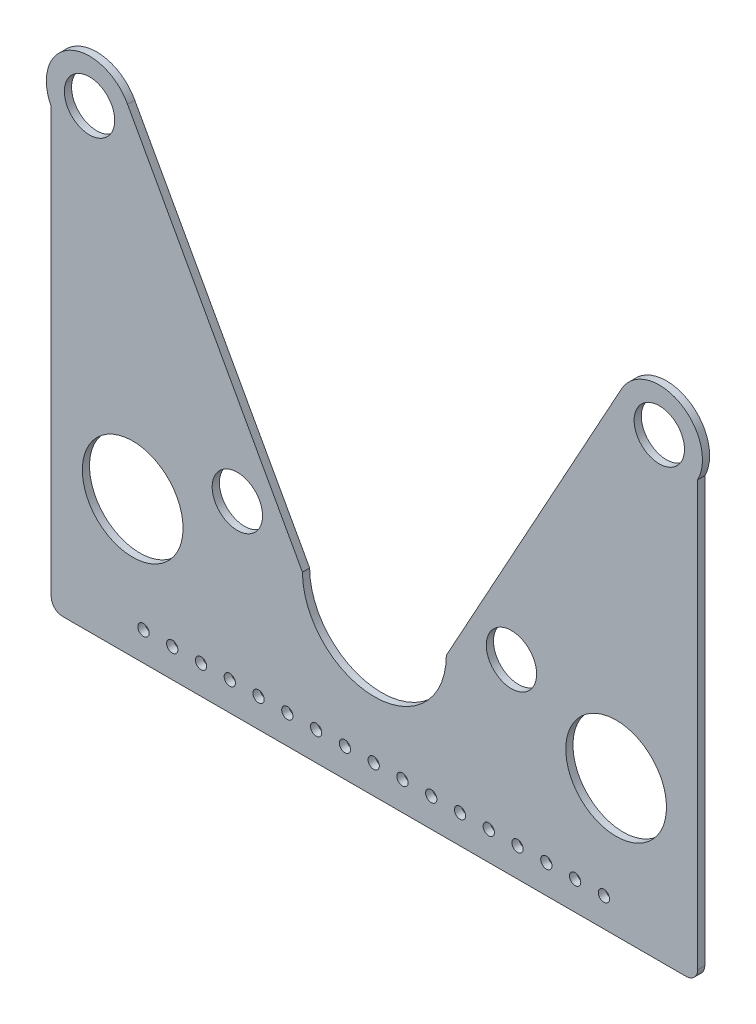
ISO-10303-21;
HEADER;
FILE_DESCRIPTION(('STEP AP214'),'2;1');
FILE_NAME('part.step','',(''),(''),'','','');
FILE_SCHEMA(('AUTOMOTIVE_DESIGN { 1 0 10303 214 1 1 1 1 }'));
ENDSEC;
DATA;
#1=APPLICATION_CONTEXT('core data for automotive mechanical design processes');
#2=APPLICATION_PROTOCOL_DEFINITION('international standard','automotive_design',2000,#1);
#3=PRODUCT_CONTEXT('',#1,'mechanical');
#4=PRODUCT('Part','Part','',(#3));
#5=PRODUCT_RELATED_PRODUCT_CATEGORY('part','',(#4));
#6=PRODUCT_DEFINITION_FORMATION('','',#4);
#7=PRODUCT_DEFINITION_CONTEXT('part definition',#1,'design');
#8=PRODUCT_DEFINITION('design','',#6,#7);
#9=PRODUCT_DEFINITION_SHAPE('','',#8);
#10=(LENGTH_UNIT() NAMED_UNIT(*) SI_UNIT(.MILLI.,.METRE.));
#11=(NAMED_UNIT(*) PLANE_ANGLE_UNIT() SI_UNIT($,.RADIAN.));
#12=(NAMED_UNIT(*) SI_UNIT($,.STERADIAN.) SOLID_ANGLE_UNIT());
#13=UNCERTAINTY_MEASURE_WITH_UNIT(LENGTH_MEASURE(1.E-05),#10,'distance_accuracy_value','');
#14=(GEOMETRIC_REPRESENTATION_CONTEXT(3) GLOBAL_UNCERTAINTY_ASSIGNED_CONTEXT((#13)) GLOBAL_UNIT_ASSIGNED_CONTEXT((#10,
#11,#12)) REPRESENTATION_CONTEXT('',''));
#15=CARTESIAN_POINT('',(0.,0.,0.));
#16=DIRECTION('',(0.,0.,1.));
#17=DIRECTION('',(1.,0.,0.));
#18=AXIS2_PLACEMENT_3D('',#15,#16,#17);
#19=CARTESIAN_POINT('',(125.72681492115,131.243846083957,3.175));
#20=DIRECTION('',(0.,0.,-1.));
#21=DIRECTION('',(-1.,0.,0.));
#22=AXIS2_PLACEMENT_3D('',#19,#20,#21);
#23=CYLINDRICAL_SURFACE('',#22,19.0499999999926);
#24=CARTESIAN_POINT('',(125.72681492115,131.243846083957,0.));
#25=DIRECTION('',(0.,0.,1.));
#26=DIRECTION('',(1.,0.,0.));
#27=AXIS2_PLACEMENT_3D('',#24,#25,#26);
#28=CIRCLE('',#27,19.0499999999926);
#29=CARTESIAN_POINT('',(108.918256202556,140.209048468959,0.));
#30=VERTEX_POINT('',#29);
#31=CARTESIAN_POINT('',(142.632381684572,122.462939957225,0.));
#32=VERTEX_POINT('',#31);
#33=EDGE_CURVE('E253',#30,#32,#28,.F.);
#34=ORIENTED_EDGE('',*,*,#33,.F.);
#35=DIRECTION('',(0.,0.,-1.));
#36=VECTOR('',#35,1.);
#37=CARTESIAN_POINT('',(108.918256202556,140.209048468959,3.175));
#38=LINE('',#37,#36);
#39=CARTESIAN_POINT('',(108.918256202556,140.209048468959,3.175));
#40=VERTEX_POINT('',#39);
#41=EDGE_CURVE('E11',#40,#30,#38,.T.);
#42=ORIENTED_EDGE('',*,*,#41,.F.);
#43=CARTESIAN_POINT('',(125.72681492115,131.243846083957,3.175));
#44=DIRECTION('',(0.,0.,1.));
#45=DIRECTION('',(1.,0.,0.));
#46=AXIS2_PLACEMENT_3D('',#43,#44,#45);
#47=CIRCLE('',#46,19.0499999999926);
#48=CARTESIAN_POINT('',(142.632381684572,122.462939957225,3.175));
#49=VERTEX_POINT('',#48);
#50=EDGE_CURVE('E352',#40,#49,#47,.F.);
#51=ORIENTED_EDGE('',*,*,#50,.T.);
#52=DIRECTION('',(0.,0.,-1.));
#53=VECTOR('',#52,1.);
#54=CARTESIAN_POINT('',(142.632381684572,122.462939957225,3.175));
#55=LINE('',#54,#53);
#56=EDGE_CURVE('E104',#49,#32,#55,.T.);
#57=ORIENTED_EDGE('',*,*,#56,.T.);
#58=EDGE_LOOP('',(#34,#42,#51,#57));
#59=FACE_BOUND('',#58,.T.);
#60=ADVANCED_FACE('F45',(#59),#23,.T.);
#61=CARTESIAN_POINT('',(24.3683765677402,-13.4118671138123,3.175));
#62=DIRECTION('',(-0.876075295504555,0.48217432180344,0.));
#63=DIRECTION('',(-0.48217432180344,-0.876075295504555,0.));
#64=AXIS2_PLACEMENT_3D('',#61,#62,#63);
#65=PLANE('',#64);
#66=DIRECTION('',(0.48217432180344,0.876075295504555,0.));
#67=VECTOR('',#66,1.);
#68=CARTESIAN_POINT('',(24.3683765677402,-13.4118671138123,0.));
#69=LINE('',#68,#67);
#70=CARTESIAN_POINT('',(31.75,0.,0.));
#71=VERTEX_POINT('',#70);
#72=EDGE_CURVE('E256',#71,#30,#69,.T.);
#73=ORIENTED_EDGE('',*,*,#72,.F.);
#74=DIRECTION('',(0.,0.,-1.));
#75=VECTOR('',#74,1.);
#76=CARTESIAN_POINT('',(31.75,0.,3.175));
#77=LINE('',#76,#75);
#78=CARTESIAN_POINT('',(31.75,0.,3.175));
#79=VERTEX_POINT('',#78);
#80=EDGE_CURVE('E55',#79,#71,#77,.T.);
#81=ORIENTED_EDGE('',*,*,#80,.F.);
#82=DIRECTION('',(0.48217432180344,0.876075295504555,0.));
#83=VECTOR('',#82,1.);
#84=CARTESIAN_POINT('',(24.3683765677402,-13.4118671138123,3.175));
#85=LINE('',#84,#83);
#86=EDGE_CURVE('E348',#79,#40,#85,.T.);
#87=ORIENTED_EDGE('',*,*,#86,.T.);
#88=ORIENTED_EDGE('',*,*,#41,.T.);
#89=EDGE_LOOP('',(#73,#81,#87,#88));
#90=FACE_BOUND('',#89,.T.);
#91=ADVANCED_FACE('F334',(#90),#65,.T.);
#92=CARTESIAN_POINT('',(0.,0.,3.175));
#93=DIRECTION('',(0.,0.,-1.));
#94=DIRECTION('',(-1.,0.,0.));
#95=AXIS2_PLACEMENT_3D('',#92,#93,#94);
#96=CYLINDRICAL_SURFACE('',#95,31.75);
#97=CARTESIAN_POINT('',(0.,0.,0.));
#98=DIRECTION('',(0.,0.,1.));
#99=DIRECTION('',(1.,0.,0.));
#100=AXIS2_PLACEMENT_3D('',#97,#98,#99);
#101=CIRCLE('',#100,31.75);
#102=CARTESIAN_POINT('',(-31.75,0.,0.));
#103=VERTEX_POINT('',#102);
#104=EDGE_CURVE('E260',#103,#71,#101,.T.);
#105=ORIENTED_EDGE('',*,*,#104,.F.);
#106=DIRECTION('',(0.,0.,-1.));
#107=VECTOR('',#106,1.);
#108=CARTESIAN_POINT('',(-31.75,0.,3.175));
#109=LINE('',#108,#107);
#110=CARTESIAN_POINT('',(-31.75,0.,3.175));
#111=VERTEX_POINT('',#110);
#112=EDGE_CURVE('E321',#111,#103,#109,.T.);
#113=ORIENTED_EDGE('',*,*,#112,.F.);
#114=CARTESIAN_POINT('',(0.,0.,3.175));
#115=DIRECTION('',(0.,0.,1.));
#116=DIRECTION('',(1.,0.,0.));
#117=AXIS2_PLACEMENT_3D('',#114,#115,#116);
#118=CIRCLE('',#117,31.75);
#119=EDGE_CURVE('E330',#111,#79,#118,.T.);
#120=ORIENTED_EDGE('',*,*,#119,.T.);
#121=ORIENTED_EDGE('',*,*,#80,.T.);
#122=EDGE_LOOP('',(#105,#113,#120,#121));
#123=FACE_BOUND('',#122,.T.);
#124=ADVANCED_FACE('F328',(#123),#96,.F.);
#125=CARTESIAN_POINT('',(-24.3683765677402,-13.4118671138123,3.175));
#126=DIRECTION('',(-0.876075295504555,-0.48217432180344,0.));
#127=DIRECTION('',(0.48217432180344,-0.876075295504555,0.));
#128=AXIS2_PLACEMENT_3D('',#125,#126,#127);
#129=PLANE('',#128);
#130=DIRECTION('',(-0.48217432180344,0.876075295504555,0.));
#131=VECTOR('',#130,1.);
#132=CARTESIAN_POINT('',(-24.3683765677402,-13.4118671138123,0.));
#133=LINE('',#132,#131);
#134=CARTESIAN_POINT('',(-108.918256202556,140.209048468959,0.));
#135=VERTEX_POINT('',#134);
#136=EDGE_CURVE('E264',#103,#135,#133,.T.);
#137=ORIENTED_EDGE('',*,*,#136,.T.);
#138=DIRECTION('',(0.,0.,-1.));
#139=VECTOR('',#138,1.);
#140=CARTESIAN_POINT('',(-108.918256202556,140.209048468959,3.175));
#141=LINE('',#140,#139);
#142=CARTESIAN_POINT('',(-108.918256202556,140.209048468959,3.175));
#143=VERTEX_POINT('',#142);
#144=EDGE_CURVE('E317',#143,#135,#141,.T.);
#145=ORIENTED_EDGE('',*,*,#144,.F.);
#146=DIRECTION('',(-0.48217432180344,0.876075295504555,0.));
#147=VECTOR('',#146,1.);
#148=CARTESIAN_POINT('',(-24.3683765677402,-13.4118671138123,3.175));
#149=LINE('',#148,#147);
#150=EDGE_CURVE('E343',#111,#143,#149,.T.);
#151=ORIENTED_EDGE('',*,*,#150,.F.);
#152=ORIENTED_EDGE('',*,*,#112,.T.);
#153=EDGE_LOOP('',(#137,#145,#151,#152));
#154=FACE_BOUND('',#153,.T.);
#155=ADVANCED_FACE('F340',(#154),#129,.F.);
#156=CARTESIAN_POINT('',(-125.726814921127,131.243846083957,3.175));
#157=DIRECTION('',(0.,0.,-1.));
#158=DIRECTION('',(-1.,0.,0.));
#159=AXIS2_PLACEMENT_3D('',#156,#157,#158);
#160=CYLINDRICAL_SURFACE('',#159,19.0499999999942);
#161=CARTESIAN_POINT('',(-125.726814921127,131.243846083957,0.));
#162=DIRECTION('',(0.,0.,1.));
#163=DIRECTION('',(1.,0.,0.));
#164=AXIS2_PLACEMENT_3D('',#161,#162,#163);
#165=CIRCLE('',#164,19.0499999999942);
#166=CARTESIAN_POINT('',(-142.632381684574,122.462939957223,0.));
#167=VERTEX_POINT('',#166);
#168=EDGE_CURVE('E268',#135,#167,#165,.T.);
#169=ORIENTED_EDGE('',*,*,#168,.T.);
#170=DIRECTION('',(0.,0.,-1.));
#171=VECTOR('',#170,1.);
#172=CARTESIAN_POINT('',(-142.632381684574,122.462939957223,3.175));
#173=LINE('',#172,#171);
#174=CARTESIAN_POINT('',(-142.632381684574,122.462939957223,3.175));
#175=VERTEX_POINT('',#174);
#176=EDGE_CURVE('E313',#175,#167,#173,.T.);
#177=ORIENTED_EDGE('',*,*,#176,.F.);
#178=CARTESIAN_POINT('',(-125.726814921127,131.243846083957,3.175));
#179=DIRECTION('',(0.,0.,1.));
#180=DIRECTION('',(1.,0.,0.));
#181=AXIS2_PLACEMENT_3D('',#178,#179,#180);
#182=CIRCLE('',#181,19.0499999999942);
#183=EDGE_CURVE('E346',#143,#175,#182,.T.);
#184=ORIENTED_EDGE('',*,*,#183,.F.);
#185=ORIENTED_EDGE('',*,*,#144,.T.);
#186=EDGE_LOOP('',(#169,#177,#184,#185));
#187=FACE_BOUND('',#186,.T.);
#188=ADVANCED_FACE('F366',(#187),#160,.T.);
#189=CARTESIAN_POINT('',(-142.632381684574,0.,3.175));
#190=DIRECTION('',(1.,0.,0.));
#191=DIRECTION('',(0.,0.,-1.));
#192=AXIS2_PLACEMENT_3D('',#189,#190,#191);
#193=PLANE('',#192);
#194=DIRECTION('',(0.,-1.,0.));
#195=VECTOR('',#194,1.);
#196=CARTESIAN_POINT('',(-142.632381684574,0.,0.));
#197=LINE('',#196,#195);
#198=CARTESIAN_POINT('',(-142.632381684574,-64.7699999999989,0.));
#199=VERTEX_POINT('',#198);
#200=EDGE_CURVE('E272',#167,#199,#197,.T.);
#201=ORIENTED_EDGE('',*,*,#200,.T.);
#202=DIRECTION('',(0.,0.,-1.));
#203=VECTOR('',#202,1.);
#204=CARTESIAN_POINT('',(-142.632381684574,-64.7699999999989,3.175));
#205=LINE('',#204,#203);
#206=CARTESIAN_POINT('',(-142.632381684574,-64.7699999999989,3.175));
#207=VERTEX_POINT('',#206);
#208=EDGE_CURVE('E310',#207,#199,#205,.T.);
#209=ORIENTED_EDGE('',*,*,#208,.F.);
#210=DIRECTION('',(0.,-1.,0.));
#211=VECTOR('',#210,1.);
#212=CARTESIAN_POINT('',(-142.632381684574,0.,3.175));
#213=LINE('',#212,#211);
#214=EDGE_CURVE('E155',#175,#207,#213,.T.);
#215=ORIENTED_EDGE('',*,*,#214,.F.);
#216=ORIENTED_EDGE('',*,*,#176,.T.);
#217=EDGE_LOOP('',(#201,#209,#215,#216));
#218=FACE_BOUND('',#217,.T.);
#219=ADVANCED_FACE('F361',(#218),#193,.F.);
#220=CARTESIAN_POINT('',(-137.552381684574,-64.7699999999989,3.175));
#221=DIRECTION('',(0.,0.,-1.));
#222=DIRECTION('',(-1.,0.,0.));
#223=AXIS2_PLACEMENT_3D('',#220,#221,#222);
#224=CYLINDRICAL_SURFACE('',#223,5.08);
#225=CARTESIAN_POINT('',(-137.552381684574,-64.7699999999989,0.));
#226=DIRECTION('',(0.,0.,1.));
#227=DIRECTION('',(1.,0.,0.));
#228=AXIS2_PLACEMENT_3D('',#225,#226,#227);
#229=CIRCLE('',#228,5.08);
#230=CARTESIAN_POINT('',(-137.552381684574,-69.8499999999989,0.));
#231=VERTEX_POINT('',#230);
#232=EDGE_CURVE('E276',#231,#199,#229,.F.);
#233=ORIENTED_EDGE('',*,*,#232,.F.);
#234=DIRECTION('',(0.,0.,-1.));
#235=VECTOR('',#234,1.);
#236=CARTESIAN_POINT('',(-137.552381684574,-69.8499999999989,3.175));
#237=LINE('',#236,#235);
#238=CARTESIAN_POINT('',(-137.552381684574,-69.8499999999989,3.175));
#239=VERTEX_POINT('',#238);
#240=EDGE_CURVE('E139',#239,#231,#237,.T.);
#241=ORIENTED_EDGE('',*,*,#240,.F.);
#242=CARTESIAN_POINT('',(-137.552381684574,-64.7699999999989,3.175));
#243=DIRECTION('',(0.,0.,1.));
#244=DIRECTION('',(1.,0.,0.));
#245=AXIS2_PLACEMENT_3D('',#242,#243,#244);
#246=CIRCLE('',#245,5.08);
#247=EDGE_CURVE('E151',#239,#207,#246,.F.);
#248=ORIENTED_EDGE('',*,*,#247,.T.);
#249=ORIENTED_EDGE('',*,*,#208,.T.);
#250=EDGE_LOOP('',(#233,#241,#248,#249));
#251=FACE_BOUND('',#250,.T.);
#252=ADVANCED_FACE('F364',(#251),#224,.T.);
#253=CARTESIAN_POINT('',(0.,-69.8499999999989,3.175));
#254=DIRECTION('',(0.,-1.,0.));
#255=DIRECTION('',(1.,0.,0.));
#256=AXIS2_PLACEMENT_3D('',#253,#254,#255);
#257=PLANE('',#256);
#258=DIRECTION('',(-1.,0.,0.));
#259=VECTOR('',#258,1.);
#260=CARTESIAN_POINT('',(0.,-69.8499999999989,0.));
#261=LINE('',#260,#259);
#262=CARTESIAN_POINT('',(137.552381684575,-69.8499999999989,0.));
#263=VERTEX_POINT('',#262);
#264=EDGE_CURVE('E135',#263,#231,#261,.T.);
#265=ORIENTED_EDGE('',*,*,#264,.F.);
#266=DIRECTION('',(0.,0.,-1.));
#267=VECTOR('',#266,1.);
#268=CARTESIAN_POINT('',(137.552381684575,-69.8499999999989,3.175));
#269=LINE('',#268,#267);
#270=CARTESIAN_POINT('',(137.552381684575,-69.8499999999989,3.175));
#271=VERTEX_POINT('',#270);
#272=EDGE_CURVE('E129',#271,#263,#269,.T.);
#273=ORIENTED_EDGE('',*,*,#272,.F.);
#274=DIRECTION('',(-1.,0.,0.));
#275=VECTOR('',#274,1.);
#276=CARTESIAN_POINT('',(0.,-69.8499999999989,3.175));
#277=LINE('',#276,#275);
#278=EDGE_CURVE('E133',#271,#239,#277,.T.);
#279=ORIENTED_EDGE('',*,*,#278,.T.);
#280=ORIENTED_EDGE('',*,*,#240,.T.);
#281=EDGE_LOOP('',(#265,#273,#279,#280));
#282=FACE_BOUND('',#281,.T.);
#283=ADVANCED_FACE('F131',(#282),#257,.T.);
#284=CARTESIAN_POINT('',(137.552381684575,-64.7699999999989,3.175));
#285=DIRECTION('',(0.,0.,-1.));
#286=DIRECTION('',(-1.,0.,0.));
#287=AXIS2_PLACEMENT_3D('',#284,#285,#286);
#288=CYLINDRICAL_SURFACE('',#287,5.08);
#289=CARTESIAN_POINT('',(137.552381684575,-64.7699999999989,0.));
#290=DIRECTION('',(0.,0.,1.));
#291=DIRECTION('',(1.,0.,0.));
#292=AXIS2_PLACEMENT_3D('',#289,#290,#291);
#293=CIRCLE('',#292,5.08);
#294=CARTESIAN_POINT('',(142.632381684575,-64.7699999999988,0.));
#295=VERTEX_POINT('',#294);
#296=EDGE_CURVE('E282',#263,#295,#293,.T.);
#297=ORIENTED_EDGE('',*,*,#296,.T.);
#298=DIRECTION('',(0.,0.,-1.));
#299=VECTOR('',#298,1.);
#300=CARTESIAN_POINT('',(142.632381684575,-64.7699999999988,3.175));
#301=LINE('',#300,#299);
#302=CARTESIAN_POINT('',(142.632381684575,-64.7699999999988,3.175));
#303=VERTEX_POINT('',#302);
#304=EDGE_CURVE('E140',#303,#295,#301,.T.);
#305=ORIENTED_EDGE('',*,*,#304,.F.);
#306=CARTESIAN_POINT('',(137.552381684575,-64.7699999999989,3.175));
#307=DIRECTION('',(0.,0.,1.));
#308=DIRECTION('',(1.,0.,0.));
#309=AXIS2_PLACEMENT_3D('',#306,#307,#308);
#310=CIRCLE('',#309,5.08);
#311=EDGE_CURVE('E143',#271,#303,#310,.T.);
#312=ORIENTED_EDGE('',*,*,#311,.F.);
#313=ORIENTED_EDGE('',*,*,#272,.T.);
#314=EDGE_LOOP('',(#297,#305,#312,#313));
#315=FACE_BOUND('',#314,.T.);
#316=ADVANCED_FACE('F144',(#315),#288,.T.);
#317=CARTESIAN_POINT('',(-101.917500000001,-57.1499999999989,3.175));
#318=DIRECTION('',(0.,0.,-1.));
#319=DIRECTION('',(-1.,0.,0.));
#320=AXIS2_PLACEMENT_3D('',#317,#318,#319);
#321=CYLINDRICAL_SURFACE('',#320,2.4891999999998);
#322=CARTESIAN_POINT('',(-101.917500000001,-57.1499999999989,3.175));
#323=DIRECTION('',(0.,0.,1.));
#324=DIRECTION('',(1.,0.,0.));
#325=AXIS2_PLACEMENT_3D('',#322,#323,#324);
#326=CIRCLE('',#325,2.4891999999998);
#327=CARTESIAN_POINT('',(-99.4283000000008,-57.1499999999989,3.175));
#328=VERTEX_POINT('',#327);
#329=EDGE_CURVE('E169',#328,#328,#326,.T.);
#330=ORIENTED_EDGE('',*,*,#329,.T.);
#331=EDGE_LOOP('',(#330));
#332=FACE_BOUND('',#331,.T.);
#333=CARTESIAN_POINT('',(-101.917500000001,-57.1499999999989,0.));
#334=DIRECTION('',(0.,0.,1.));
#335=DIRECTION('',(1.,0.,0.));
#336=AXIS2_PLACEMENT_3D('',#333,#334,#335);
#337=CIRCLE('',#336,2.4891999999998);
#338=CARTESIAN_POINT('',(-99.4283000000008,-57.1499999999989,0.));
#339=VERTEX_POINT('',#338);
#340=EDGE_CURVE('E295',#339,#339,#337,.T.);
#341=ORIENTED_EDGE('',*,*,#340,.F.);
#342=EDGE_LOOP('',(#341));
#343=FACE_BOUND('',#342,.T.);
#344=ADVANCED_FACE('F528',(#332,#343),#321,.F.);
#345=CARTESIAN_POINT('',(-60.4845323125526,12.7000000000026,3.175));
#346=DIRECTION('',(0.,0.,-1.));
#347=DIRECTION('',(-1.,0.,0.));
#348=AXIS2_PLACEMENT_3D('',#345,#346,#347);
#349=CYLINDRICAL_SURFACE('',#348,11.112499999997);
#350=CARTESIAN_POINT('',(-60.4845323125526,12.7000000000026,3.175));
#351=DIRECTION('',(0.,0.,1.));
#352=DIRECTION('',(1.,0.,0.));
#353=AXIS2_PLACEMENT_3D('',#350,#351,#352);
#354=CIRCLE('',#353,11.112499999997);
#355=CARTESIAN_POINT('',(-49.3720323125556,12.7000000000026,3.175));
#356=VERTEX_POINT('',#355);
#357=EDGE_CURVE('E165',#356,#356,#354,.T.);
#358=ORIENTED_EDGE('',*,*,#357,.T.);
#359=EDGE_LOOP('',(#358));
#360=FACE_BOUND('',#359,.T.);
#361=CARTESIAN_POINT('',(-60.4845323125526,12.7000000000026,0.));
#362=DIRECTION('',(0.,0.,1.));
#363=DIRECTION('',(1.,0.,0.));
#364=AXIS2_PLACEMENT_3D('',#361,#362,#363);
#365=CIRCLE('',#364,11.112499999997);
#366=CARTESIAN_POINT('',(-49.3720323125556,12.7000000000026,0.));
#367=VERTEX_POINT('',#366);
#368=EDGE_CURVE('E291',#367,#367,#365,.T.);
#369=ORIENTED_EDGE('',*,*,#368,.F.);
#370=EDGE_LOOP('',(#369));
#371=FACE_BOUND('',#370,.T.);
#372=ADVANCED_FACE('F531',(#360,#371),#349,.F.);
#373=CARTESIAN_POINT('',(-125.726814921127,131.243846083957,3.175));
#374=DIRECTION('',(0.,0.,-1.));
#375=DIRECTION('',(-1.,0.,0.));
#376=AXIS2_PLACEMENT_3D('',#373,#374,#375);
#377=CYLINDRICAL_SURFACE('',#376,11.1125);
#378=CARTESIAN_POINT('',(-125.726814921127,131.243846083957,3.175));
#379=DIRECTION('',(0.,0.,1.));
#380=DIRECTION('',(1.,0.,0.));
#381=AXIS2_PLACEMENT_3D('',#378,#379,#380);
#382=CIRCLE('',#381,11.1125);
#383=CARTESIAN_POINT('',(-114.614314921128,131.243846083957,3.175));
#384=VERTEX_POINT('',#383);
#385=EDGE_CURVE('E161',#384,#384,#382,.T.);
#386=ORIENTED_EDGE('',*,*,#385,.T.);
#387=EDGE_LOOP('',(#386));
#388=FACE_BOUND('',#387,.T.);
#389=CARTESIAN_POINT('',(-125.726814921127,131.243846083957,0.));
#390=DIRECTION('',(0.,0.,1.));
#391=DIRECTION('',(1.,0.,0.));
#392=AXIS2_PLACEMENT_3D('',#389,#390,#391);
#393=CIRCLE('',#392,11.1125);
#394=CARTESIAN_POINT('',(-114.614314921128,131.243846083957,0.));
#395=VERTEX_POINT('',#394);
#396=EDGE_CURVE('E287',#395,#395,#393,.T.);
#397=ORIENTED_EDGE('',*,*,#396,.F.);
#398=EDGE_LOOP('',(#397));
#399=FACE_BOUND('',#398,.T.);
#400=ADVANCED_FACE('F535',(#388,#399),#377,.F.);
#401=CARTESIAN_POINT('',(142.632381684575,0.,3.175));
#402=DIRECTION('',(-1.,0.,0.));
#403=DIRECTION('',(0.,0.,1.));
#404=AXIS2_PLACEMENT_3D('',#401,#402,#403);
#405=PLANE('',#404);
#406=DIRECTION('',(0.,1.,0.));
#407=VECTOR('',#406,1.);
#408=CARTESIAN_POINT('',(142.632381684575,0.,0.));
#409=LINE('',#408,#407);
#410=EDGE_CURVE('E97',#295,#32,#409,.T.);
#411=ORIENTED_EDGE('',*,*,#410,.T.);
#412=ORIENTED_EDGE('',*,*,#56,.F.);
#413=DIRECTION('',(0.,1.,0.));
#414=VECTOR('',#413,1.);
#415=CARTESIAN_POINT('',(142.632381684575,0.,3.175));
#416=LINE('',#415,#414);
#417=EDGE_CURVE('E63',#303,#49,#416,.T.);
#418=ORIENTED_EDGE('',*,*,#417,.F.);
#419=ORIENTED_EDGE('',*,*,#304,.T.);
#420=EDGE_LOOP('',(#411,#412,#418,#419));
#421=FACE_BOUND('',#420,.T.);
#422=ADVANCED_FACE('F387',(#421),#405,.F.);
#423=CARTESIAN_POINT('',(125.72681492115,131.243846083957,3.175));
#424=DIRECTION('',(0.,0.,-1.));
#425=DIRECTION('',(-1.,0.,0.));
#426=AXIS2_PLACEMENT_3D('',#423,#424,#425);
#427=CYLINDRICAL_SURFACE('',#426,11.1124999999766);
#428=CARTESIAN_POINT('',(125.72681492115,131.243846083957,3.175));
#429=DIRECTION('',(0.,0.,1.));
#430=DIRECTION('',(1.,0.,0.));
#431=AXIS2_PLACEMENT_3D('',#428,#429,#430);
#432=CIRCLE('',#431,11.1124999999766);
#433=CARTESIAN_POINT('',(136.839314921127,131.243846083957,3.175));
#434=VERTEX_POINT('',#433);
#435=EDGE_CURVE('E831',#434,#434,#432,.F.);
#436=ORIENTED_EDGE('',*,*,#435,.F.);
#437=EDGE_LOOP('',(#436));
#438=FACE_BOUND('',#437,.T.);
#439=CARTESIAN_POINT('',(125.72681492115,131.243846083957,0.));
#440=DIRECTION('',(0.,0.,1.));
#441=DIRECTION('',(1.,0.,0.));
#442=AXIS2_PLACEMENT_3D('',#439,#440,#441);
#443=CIRCLE('',#442,11.1124999999766);
#444=CARTESIAN_POINT('',(136.839314921127,131.243846083957,0.));
#445=VERTEX_POINT('',#444);
#446=EDGE_CURVE('E249',#445,#445,#443,.F.);
#447=ORIENTED_EDGE('',*,*,#446,.T.);
#448=EDGE_LOOP('',(#447));
#449=FACE_BOUND('',#448,.T.);
#450=ADVANCED_FACE('F383',(#438,#449),#427,.F.);
#451=CARTESIAN_POINT('',(-89.2175000000006,-57.1499999999989,3.175));
#452=DIRECTION('',(0.,0.,-1.));
#453=DIRECTION('',(-1.,0.,0.));
#454=AXIS2_PLACEMENT_3D('',#451,#452,#453);
#455=CYLINDRICAL_SURFACE('',#454,2.4891999999998);
#456=CARTESIAN_POINT('',(-89.2175000000006,-57.1499999999989,3.175));
#457=DIRECTION('',(0.,0.,1.));
#458=DIRECTION('',(1.,0.,0.));
#459=AXIS2_PLACEMENT_3D('',#456,#457,#458);
#460=CIRCLE('',#459,2.4891999999998);
#461=CARTESIAN_POINT('',(-86.7283000000008,-57.1499999999989,3.175));
#462=VERTEX_POINT('',#461);
#463=EDGE_CURVE('E834',#462,#462,#460,.T.);
#464=ORIENTED_EDGE('',*,*,#463,.T.);
#465=EDGE_LOOP('',(#464));
#466=FACE_BOUND('',#465,.T.);
#467=CARTESIAN_POINT('',(-89.2175000000006,-57.1499999999989,0.));
#468=DIRECTION('',(0.,0.,1.));
#469=DIRECTION('',(1.,0.,0.));
#470=AXIS2_PLACEMENT_3D('',#467,#468,#469);
#471=CIRCLE('',#470,2.4891999999998);
#472=CARTESIAN_POINT('',(-86.7283000000008,-57.1499999999989,0.));
#473=VERTEX_POINT('',#472);
#474=EDGE_CURVE('E245',#473,#473,#471,.T.);
#475=ORIENTED_EDGE('',*,*,#474,.F.);
#476=EDGE_LOOP('',(#475));
#477=FACE_BOUND('',#476,.T.);
#478=ADVANCED_FACE('F386',(#466,#477),#455,.F.);
#479=CARTESIAN_POINT('',(-76.5175000000006,-57.1499999999989,3.175));
#480=DIRECTION('',(0.,0.,-1.));
#481=DIRECTION('',(-1.,0.,0.));
#482=AXIS2_PLACEMENT_3D('',#479,#480,#481);
#483=CYLINDRICAL_SURFACE('',#482,2.4891999999998);
#484=CARTESIAN_POINT('',(-76.5175000000006,-57.1499999999989,3.175));
#485=DIRECTION('',(0.,0.,1.));
#486=DIRECTION('',(1.,0.,0.));
#487=AXIS2_PLACEMENT_3D('',#484,#485,#486);
#488=CIRCLE('',#487,2.4891999999998);
#489=CARTESIAN_POINT('',(-74.0283000000008,-57.1499999999989,3.175));
#490=VERTEX_POINT('',#489);
#491=EDGE_CURVE('E840',#490,#490,#488,.T.);
#492=ORIENTED_EDGE('',*,*,#491,.T.);
#493=EDGE_LOOP('',(#492));
#494=FACE_BOUND('',#493,.T.);
#495=CARTESIAN_POINT('',(-76.5175000000006,-57.1499999999989,0.));
#496=DIRECTION('',(0.,0.,1.));
#497=DIRECTION('',(1.,0.,0.));
#498=AXIS2_PLACEMENT_3D('',#495,#496,#497);
#499=CIRCLE('',#498,2.4891999999998);
#500=CARTESIAN_POINT('',(-74.0283000000008,-57.1499999999989,0.));
#501=VERTEX_POINT('',#500);
#502=EDGE_CURVE('E241',#501,#501,#499,.T.);
#503=ORIENTED_EDGE('',*,*,#502,.F.);
#504=EDGE_LOOP('',(#503));
#505=FACE_BOUND('',#504,.T.);
#506=ADVANCED_FACE('F391',(#494,#505),#483,.F.);
#507=CARTESIAN_POINT('',(-63.8175000000006,-57.1499999999989,3.175));
#508=DIRECTION('',(0.,0.,-1.));
#509=DIRECTION('',(-1.,0.,0.));
#510=AXIS2_PLACEMENT_3D('',#507,#508,#509);
#511=CYLINDRICAL_SURFACE('',#510,2.4891999999998);
#512=CARTESIAN_POINT('',(-63.8175000000006,-57.1499999999989,3.175));
#513=DIRECTION('',(0.,0.,1.));
#514=DIRECTION('',(1.,0.,0.));
#515=AXIS2_PLACEMENT_3D('',#512,#513,#514);
#516=CIRCLE('',#515,2.4891999999998);
#517=CARTESIAN_POINT('',(-61.3283000000008,-57.1499999999989,3.175));
#518=VERTEX_POINT('',#517);
#519=EDGE_CURVE('E844',#518,#518,#516,.T.);
#520=ORIENTED_EDGE('',*,*,#519,.T.);
#521=EDGE_LOOP('',(#520));
#522=FACE_BOUND('',#521,.T.);
#523=CARTESIAN_POINT('',(-63.8175000000006,-57.1499999999989,0.));
#524=DIRECTION('',(0.,0.,1.));
#525=DIRECTION('',(1.,0.,0.));
#526=AXIS2_PLACEMENT_3D('',#523,#524,#525);
#527=CIRCLE('',#526,2.4891999999998);
#528=CARTESIAN_POINT('',(-61.3283000000008,-57.1499999999989,0.));
#529=VERTEX_POINT('',#528);
#530=EDGE_CURVE('E237',#529,#529,#527,.T.);
#531=ORIENTED_EDGE('',*,*,#530,.F.);
#532=EDGE_LOOP('',(#531));
#533=FACE_BOUND('',#532,.T.);
#534=ADVANCED_FACE('F395',(#522,#533),#511,.F.);
#535=CARTESIAN_POINT('',(-51.1175000000006,-57.1499999999989,3.175));
#536=DIRECTION('',(0.,0.,-1.));
#537=DIRECTION('',(-1.,0.,0.));
#538=AXIS2_PLACEMENT_3D('',#535,#536,#537);
#539=CYLINDRICAL_SURFACE('',#538,2.4891999999998);
#540=CARTESIAN_POINT('',(-51.1175000000006,-57.1499999999989,3.175));
#541=DIRECTION('',(0.,0.,1.));
#542=DIRECTION('',(1.,0.,0.));
#543=AXIS2_PLACEMENT_3D('',#540,#541,#542);
#544=CIRCLE('',#543,2.4891999999998);
#545=CARTESIAN_POINT('',(-48.6283000000008,-57.1499999999989,3.175));
#546=VERTEX_POINT('',#545);
#547=EDGE_CURVE('E848',#546,#546,#544,.T.);
#548=ORIENTED_EDGE('',*,*,#547,.T.);
#549=EDGE_LOOP('',(#548));
#550=FACE_BOUND('',#549,.T.);
#551=CARTESIAN_POINT('',(-51.1175000000006,-57.1499999999989,0.));
#552=DIRECTION('',(0.,0.,1.));
#553=DIRECTION('',(1.,0.,0.));
#554=AXIS2_PLACEMENT_3D('',#551,#552,#553);
#555=CIRCLE('',#554,2.4891999999998);
#556=CARTESIAN_POINT('',(-48.6283000000008,-57.1499999999989,0.));
#557=VERTEX_POINT('',#556);
#558=EDGE_CURVE('E233',#557,#557,#555,.T.);
#559=ORIENTED_EDGE('',*,*,#558,.F.);
#560=EDGE_LOOP('',(#559));
#561=FACE_BOUND('',#560,.T.);
#562=ADVANCED_FACE('F399',(#550,#561),#539,.F.);
#563=CARTESIAN_POINT('',(-38.4175000000006,-57.1499999999989,3.175));
#564=DIRECTION('',(0.,0.,-1.));
#565=DIRECTION('',(-1.,0.,0.));
#566=AXIS2_PLACEMENT_3D('',#563,#564,#565);
#567=CYLINDRICAL_SURFACE('',#566,2.4891999999998);
#568=CARTESIAN_POINT('',(-38.4175000000006,-57.1499999999989,3.175));
#569=DIRECTION('',(0.,0.,1.));
#570=DIRECTION('',(1.,0.,0.));
#571=AXIS2_PLACEMENT_3D('',#568,#569,#570);
#572=CIRCLE('',#571,2.4891999999998);
#573=CARTESIAN_POINT('',(-35.9283000000008,-57.1499999999989,3.175));
#574=VERTEX_POINT('',#573);
#575=EDGE_CURVE('E852',#574,#574,#572,.T.);
#576=ORIENTED_EDGE('',*,*,#575,.T.);
#577=EDGE_LOOP('',(#576));
#578=FACE_BOUND('',#577,.T.);
#579=CARTESIAN_POINT('',(-38.4175000000006,-57.1499999999989,0.));
#580=DIRECTION('',(0.,0.,1.));
#581=DIRECTION('',(1.,0.,0.));
#582=AXIS2_PLACEMENT_3D('',#579,#580,#581);
#583=CIRCLE('',#582,2.4891999999998);
#584=CARTESIAN_POINT('',(-35.9283000000008,-57.1499999999989,0.));
#585=VERTEX_POINT('',#584);
#586=EDGE_CURVE('E229',#585,#585,#583,.T.);
#587=ORIENTED_EDGE('',*,*,#586,.F.);
#588=EDGE_LOOP('',(#587));
#589=FACE_BOUND('',#588,.T.);
#590=ADVANCED_FACE('F403',(#578,#589),#567,.F.);
#591=CARTESIAN_POINT('',(-25.7175000000006,-57.1499999999989,3.175));
#592=DIRECTION('',(0.,0.,-1.));
#593=DIRECTION('',(-1.,0.,0.));
#594=AXIS2_PLACEMENT_3D('',#591,#592,#593);
#595=CYLINDRICAL_SURFACE('',#594,2.4891999999998);
#596=CARTESIAN_POINT('',(-25.7175000000006,-57.1499999999989,3.175));
#597=DIRECTION('',(0.,0.,1.));
#598=DIRECTION('',(1.,0.,0.));
#599=AXIS2_PLACEMENT_3D('',#596,#597,#598);
#600=CIRCLE('',#599,2.4891999999998);
#601=CARTESIAN_POINT('',(-23.2283000000008,-57.1499999999989,3.175));
#602=VERTEX_POINT('',#601);
#603=EDGE_CURVE('E856',#602,#602,#600,.T.);
#604=ORIENTED_EDGE('',*,*,#603,.T.);
#605=EDGE_LOOP('',(#604));
#606=FACE_BOUND('',#605,.T.);
#607=CARTESIAN_POINT('',(-25.7175000000006,-57.1499999999989,0.));
#608=DIRECTION('',(0.,0.,1.));
#609=DIRECTION('',(1.,0.,0.));
#610=AXIS2_PLACEMENT_3D('',#607,#608,#609);
#611=CIRCLE('',#610,2.4891999999998);
#612=CARTESIAN_POINT('',(-23.2283000000008,-57.1499999999989,0.));
#613=VERTEX_POINT('',#612);
#614=EDGE_CURVE('E225',#613,#613,#611,.T.);
#615=ORIENTED_EDGE('',*,*,#614,.F.);
#616=EDGE_LOOP('',(#615));
#617=FACE_BOUND('',#616,.T.);
#618=ADVANCED_FACE('F407',(#606,#617),#595,.F.);
#619=CARTESIAN_POINT('',(-13.0175000000006,-57.1499999999989,3.175));
#620=DIRECTION('',(0.,0.,-1.));
#621=DIRECTION('',(-1.,0.,0.));
#622=AXIS2_PLACEMENT_3D('',#619,#620,#621);
#623=CYLINDRICAL_SURFACE('',#622,2.4891999999998);
#624=CARTESIAN_POINT('',(-13.0175000000006,-57.1499999999989,3.175));
#625=DIRECTION('',(0.,0.,1.));
#626=DIRECTION('',(1.,0.,0.));
#627=AXIS2_PLACEMENT_3D('',#624,#625,#626);
#628=CIRCLE('',#627,2.4891999999998);
#629=CARTESIAN_POINT('',(-10.5283000000008,-57.1499999999989,3.175));
#630=VERTEX_POINT('',#629);
#631=EDGE_CURVE('E860',#630,#630,#628,.T.);
#632=ORIENTED_EDGE('',*,*,#631,.T.);
#633=EDGE_LOOP('',(#632));
#634=FACE_BOUND('',#633,.T.);
#635=CARTESIAN_POINT('',(-13.0175000000006,-57.1499999999989,0.));
#636=DIRECTION('',(0.,0.,1.));
#637=DIRECTION('',(1.,0.,0.));
#638=AXIS2_PLACEMENT_3D('',#635,#636,#637);
#639=CIRCLE('',#638,2.4891999999998);
#640=CARTESIAN_POINT('',(-10.5283000000008,-57.1499999999989,0.));
#641=VERTEX_POINT('',#640);
#642=EDGE_CURVE('E221',#641,#641,#639,.T.);
#643=ORIENTED_EDGE('',*,*,#642,.F.);
#644=EDGE_LOOP('',(#643));
#645=FACE_BOUND('',#644,.T.);
#646=ADVANCED_FACE('F411',(#634,#645),#623,.F.);
#647=CARTESIAN_POINT('',(-0.317500000000637,-57.1499999999989,3.175));
#648=DIRECTION('',(0.,0.,-1.));
#649=DIRECTION('',(-1.,0.,0.));
#650=AXIS2_PLACEMENT_3D('',#647,#648,#649);
#651=CYLINDRICAL_SURFACE('',#650,2.4891999999998);
#652=CARTESIAN_POINT('',(-0.317500000000637,-57.1499999999989,3.175));
#653=DIRECTION('',(0.,0.,1.));
#654=DIRECTION('',(1.,0.,0.));
#655=AXIS2_PLACEMENT_3D('',#652,#653,#654);
#656=CIRCLE('',#655,2.4891999999998);
#657=CARTESIAN_POINT('',(2.17169999999916,-57.1499999999989,3.175));
#658=VERTEX_POINT('',#657);
#659=EDGE_CURVE('E864',#658,#658,#656,.T.);
#660=ORIENTED_EDGE('',*,*,#659,.T.);
#661=EDGE_LOOP('',(#660));
#662=FACE_BOUND('',#661,.T.);
#663=CARTESIAN_POINT('',(-0.317500000000637,-57.1499999999989,0.));
#664=DIRECTION('',(0.,0.,1.));
#665=DIRECTION('',(1.,0.,0.));
#666=AXIS2_PLACEMENT_3D('',#663,#664,#665);
#667=CIRCLE('',#666,2.4891999999998);
#668=CARTESIAN_POINT('',(2.17169999999916,-57.1499999999989,0.));
#669=VERTEX_POINT('',#668);
#670=EDGE_CURVE('E217',#669,#669,#667,.T.);
#671=ORIENTED_EDGE('',*,*,#670,.F.);
#672=EDGE_LOOP('',(#671));
#673=FACE_BOUND('',#672,.T.);
#674=ADVANCED_FACE('F415',(#662,#673),#651,.F.);
#675=CARTESIAN_POINT('',(12.3824999999994,-57.1499999999989,3.175));
#676=DIRECTION('',(0.,0.,-1.));
#677=DIRECTION('',(-1.,0.,0.));
#678=AXIS2_PLACEMENT_3D('',#675,#676,#677);
#679=CYLINDRICAL_SURFACE('',#678,2.4891999999998);
#680=CARTESIAN_POINT('',(12.3824999999994,-57.1499999999989,3.175));
#681=DIRECTION('',(0.,0.,1.));
#682=DIRECTION('',(1.,0.,0.));
#683=AXIS2_PLACEMENT_3D('',#680,#681,#682);
#684=CIRCLE('',#683,2.4891999999998);
#685=CARTESIAN_POINT('',(14.8716999999992,-57.1499999999989,3.175));
#686=VERTEX_POINT('',#685);
#687=EDGE_CURVE('E868',#686,#686,#684,.T.);
#688=ORIENTED_EDGE('',*,*,#687,.T.);
#689=EDGE_LOOP('',(#688));
#690=FACE_BOUND('',#689,.T.);
#691=CARTESIAN_POINT('',(12.3824999999994,-57.1499999999989,0.));
#692=DIRECTION('',(0.,0.,1.));
#693=DIRECTION('',(1.,0.,0.));
#694=AXIS2_PLACEMENT_3D('',#691,#692,#693);
#695=CIRCLE('',#694,2.4891999999998);
#696=CARTESIAN_POINT('',(14.8716999999992,-57.1499999999989,0.));
#697=VERTEX_POINT('',#696);
#698=EDGE_CURVE('E213',#697,#697,#695,.T.);
#699=ORIENTED_EDGE('',*,*,#698,.F.);
#700=EDGE_LOOP('',(#699));
#701=FACE_BOUND('',#700,.T.);
#702=ADVANCED_FACE('F419',(#690,#701),#679,.F.);
#703=CARTESIAN_POINT('',(25.0824999999994,-57.1499999999989,3.175));
#704=DIRECTION('',(0.,0.,-1.));
#705=DIRECTION('',(-1.,0.,0.));
#706=AXIS2_PLACEMENT_3D('',#703,#704,#705);
#707=CYLINDRICAL_SURFACE('',#706,2.4891999999998);
#708=CARTESIAN_POINT('',(25.0824999999994,-57.1499999999989,3.175));
#709=DIRECTION('',(0.,0.,1.));
#710=DIRECTION('',(1.,0.,0.));
#711=AXIS2_PLACEMENT_3D('',#708,#709,#710);
#712=CIRCLE('',#711,2.4891999999998);
#713=CARTESIAN_POINT('',(27.5716999999992,-57.1499999999989,3.175));
#714=VERTEX_POINT('',#713);
#715=EDGE_CURVE('E872',#714,#714,#712,.T.);
#716=ORIENTED_EDGE('',*,*,#715,.T.);
#717=EDGE_LOOP('',(#716));
#718=FACE_BOUND('',#717,.T.);
#719=CARTESIAN_POINT('',(25.0824999999994,-57.1499999999989,0.));
#720=DIRECTION('',(0.,0.,1.));
#721=DIRECTION('',(1.,0.,0.));
#722=AXIS2_PLACEMENT_3D('',#719,#720,#721);
#723=CIRCLE('',#722,2.4891999999998);
#724=CARTESIAN_POINT('',(27.5716999999992,-57.1499999999989,0.));
#725=VERTEX_POINT('',#724);
#726=EDGE_CURVE('E209',#725,#725,#723,.T.);
#727=ORIENTED_EDGE('',*,*,#726,.F.);
#728=EDGE_LOOP('',(#727));
#729=FACE_BOUND('',#728,.T.);
#730=ADVANCED_FACE('F423',(#718,#729),#707,.F.);
#731=CARTESIAN_POINT('',(37.7824999999993,-57.1499999999989,3.175));
#732=DIRECTION('',(0.,0.,-1.));
#733=DIRECTION('',(-1.,0.,0.));
#734=AXIS2_PLACEMENT_3D('',#731,#732,#733);
#735=CYLINDRICAL_SURFACE('',#734,2.4891999999998);
#736=CARTESIAN_POINT('',(37.7824999999993,-57.1499999999989,3.175));
#737=DIRECTION('',(0.,0.,1.));
#738=DIRECTION('',(1.,0.,0.));
#739=AXIS2_PLACEMENT_3D('',#736,#737,#738);
#740=CIRCLE('',#739,2.4891999999998);
#741=CARTESIAN_POINT('',(40.2716999999992,-57.1499999999989,3.175));
#742=VERTEX_POINT('',#741);
#743=EDGE_CURVE('E876',#742,#742,#740,.T.);
#744=ORIENTED_EDGE('',*,*,#743,.T.);
#745=EDGE_LOOP('',(#744));
#746=FACE_BOUND('',#745,.T.);
#747=CARTESIAN_POINT('',(37.7824999999993,-57.1499999999989,0.));
#748=DIRECTION('',(0.,0.,1.));
#749=DIRECTION('',(1.,0.,0.));
#750=AXIS2_PLACEMENT_3D('',#747,#748,#749);
#751=CIRCLE('',#750,2.4891999999998);
#752=CARTESIAN_POINT('',(40.2716999999992,-57.1499999999989,0.));
#753=VERTEX_POINT('',#752);
#754=EDGE_CURVE('E205',#753,#753,#751,.T.);
#755=ORIENTED_EDGE('',*,*,#754,.F.);
#756=EDGE_LOOP('',(#755));
#757=FACE_BOUND('',#756,.T.);
#758=ADVANCED_FACE('F427',(#746,#757),#735,.F.);
#759=CARTESIAN_POINT('',(50.4824999999994,-57.1499999999989,3.175));
#760=DIRECTION('',(0.,0.,-1.));
#761=DIRECTION('',(-1.,0.,0.));
#762=AXIS2_PLACEMENT_3D('',#759,#760,#761);
#763=CYLINDRICAL_SURFACE('',#762,2.4891999999998);
#764=CARTESIAN_POINT('',(50.4824999999994,-57.1499999999989,3.175));
#765=DIRECTION('',(0.,0.,1.));
#766=DIRECTION('',(1.,0.,0.));
#767=AXIS2_PLACEMENT_3D('',#764,#765,#766);
#768=CIRCLE('',#767,2.4891999999998);
#769=CARTESIAN_POINT('',(52.9716999999992,-57.1499999999989,3.175));
#770=VERTEX_POINT('',#769);
#771=EDGE_CURVE('E880',#770,#770,#768,.T.);
#772=ORIENTED_EDGE('',*,*,#771,.T.);
#773=EDGE_LOOP('',(#772));
#774=FACE_BOUND('',#773,.T.);
#775=CARTESIAN_POINT('',(50.4824999999994,-57.1499999999989,0.));
#776=DIRECTION('',(0.,0.,1.));
#777=DIRECTION('',(1.,0.,0.));
#778=AXIS2_PLACEMENT_3D('',#775,#776,#777);
#779=CIRCLE('',#778,2.4891999999998);
#780=CARTESIAN_POINT('',(52.9716999999992,-57.1499999999989,0.));
#781=VERTEX_POINT('',#780);
#782=EDGE_CURVE('E201',#781,#781,#779,.T.);
#783=ORIENTED_EDGE('',*,*,#782,.F.);
#784=EDGE_LOOP('',(#783));
#785=FACE_BOUND('',#784,.T.);
#786=ADVANCED_FACE('F431',(#774,#785),#763,.F.);
#787=CARTESIAN_POINT('',(63.1824999999994,-57.1499999999989,3.175));
#788=DIRECTION('',(0.,0.,-1.));
#789=DIRECTION('',(-1.,0.,0.));
#790=AXIS2_PLACEMENT_3D('',#787,#788,#789);
#791=CYLINDRICAL_SURFACE('',#790,2.4891999999998);
#792=CARTESIAN_POINT('',(63.1824999999994,-57.1499999999989,3.175));
#793=DIRECTION('',(0.,0.,1.));
#794=DIRECTION('',(1.,0.,0.));
#795=AXIS2_PLACEMENT_3D('',#792,#793,#794);
#796=CIRCLE('',#795,2.4891999999998);
#797=CARTESIAN_POINT('',(65.6716999999991,-57.1499999999989,3.175));
#798=VERTEX_POINT('',#797);
#799=EDGE_CURVE('E884',#798,#798,#796,.T.);
#800=ORIENTED_EDGE('',*,*,#799,.T.);
#801=EDGE_LOOP('',(#800));
#802=FACE_BOUND('',#801,.T.);
#803=CARTESIAN_POINT('',(63.1824999999994,-57.1499999999989,0.));
#804=DIRECTION('',(0.,0.,1.));
#805=DIRECTION('',(1.,0.,0.));
#806=AXIS2_PLACEMENT_3D('',#803,#804,#805);
#807=CIRCLE('',#806,2.4891999999998);
#808=CARTESIAN_POINT('',(65.6716999999991,-57.1499999999989,0.));
#809=VERTEX_POINT('',#808);
#810=EDGE_CURVE('E197',#809,#809,#807,.T.);
#811=ORIENTED_EDGE('',*,*,#810,.F.);
#812=EDGE_LOOP('',(#811));
#813=FACE_BOUND('',#812,.T.);
#814=ADVANCED_FACE('F435',(#802,#813),#791,.F.);
#815=CARTESIAN_POINT('',(75.8824999999993,-57.1499999999989,3.175));
#816=DIRECTION('',(0.,0.,-1.));
#817=DIRECTION('',(-1.,0.,0.));
#818=AXIS2_PLACEMENT_3D('',#815,#816,#817);
#819=CYLINDRICAL_SURFACE('',#818,2.4891999999998);
#820=CARTESIAN_POINT('',(75.8824999999993,-57.1499999999989,3.175));
#821=DIRECTION('',(0.,0.,1.));
#822=DIRECTION('',(1.,0.,0.));
#823=AXIS2_PLACEMENT_3D('',#820,#821,#822);
#824=CIRCLE('',#823,2.4891999999998);
#825=CARTESIAN_POINT('',(78.3716999999991,-57.1499999999989,3.175));
#826=VERTEX_POINT('',#825);
#827=EDGE_CURVE('E888',#826,#826,#824,.T.);
#828=ORIENTED_EDGE('',*,*,#827,.T.);
#829=EDGE_LOOP('',(#828));
#830=FACE_BOUND('',#829,.T.);
#831=CARTESIAN_POINT('',(75.8824999999993,-57.1499999999989,0.));
#832=DIRECTION('',(0.,0.,1.));
#833=DIRECTION('',(1.,0.,0.));
#834=AXIS2_PLACEMENT_3D('',#831,#832,#833);
#835=CIRCLE('',#834,2.4891999999998);
#836=CARTESIAN_POINT('',(78.3716999999991,-57.1499999999989,0.));
#837=VERTEX_POINT('',#836);
#838=EDGE_CURVE('E193',#837,#837,#835,.T.);
#839=ORIENTED_EDGE('',*,*,#838,.F.);
#840=EDGE_LOOP('',(#839));
#841=FACE_BOUND('',#840,.T.);
#842=ADVANCED_FACE('F439',(#830,#841),#819,.F.);
#843=CARTESIAN_POINT('',(88.5824999999994,-57.1499999999989,3.175));
#844=DIRECTION('',(0.,0.,-1.));
#845=DIRECTION('',(-1.,0.,0.));
#846=AXIS2_PLACEMENT_3D('',#843,#844,#845);
#847=CYLINDRICAL_SURFACE('',#846,2.4891999999998);
#848=CARTESIAN_POINT('',(88.5824999999994,-57.1499999999989,3.175));
#849=DIRECTION('',(0.,0.,1.));
#850=DIRECTION('',(1.,0.,0.));
#851=AXIS2_PLACEMENT_3D('',#848,#849,#850);
#852=CIRCLE('',#851,2.4891999999998);
#853=CARTESIAN_POINT('',(91.0716999999992,-57.1499999999989,3.175));
#854=VERTEX_POINT('',#853);
#855=EDGE_CURVE('E892',#854,#854,#852,.T.);
#856=ORIENTED_EDGE('',*,*,#855,.T.);
#857=EDGE_LOOP('',(#856));
#858=FACE_BOUND('',#857,.T.);
#859=CARTESIAN_POINT('',(88.5824999999994,-57.1499999999989,0.));
#860=DIRECTION('',(0.,0.,1.));
#861=DIRECTION('',(1.,0.,0.));
#862=AXIS2_PLACEMENT_3D('',#859,#860,#861);
#863=CIRCLE('',#862,2.4891999999998);
#864=CARTESIAN_POINT('',(91.0716999999992,-57.1499999999989,0.));
#865=VERTEX_POINT('',#864);
#866=EDGE_CURVE('E189',#865,#865,#863,.T.);
#867=ORIENTED_EDGE('',*,*,#866,.F.);
#868=EDGE_LOOP('',(#867));
#869=FACE_BOUND('',#868,.T.);
#870=ADVANCED_FACE('F443',(#858,#869),#847,.F.);
#871=CARTESIAN_POINT('',(101.282499999999,-57.1499999999989,3.175));
#872=DIRECTION('',(0.,0.,-1.));
#873=DIRECTION('',(-1.,0.,0.));
#874=AXIS2_PLACEMENT_3D('',#871,#872,#873);
#875=CYLINDRICAL_SURFACE('',#874,2.4891999999998);
#876=CARTESIAN_POINT('',(101.282499999999,-57.1499999999989,3.175));
#877=DIRECTION('',(0.,0.,1.));
#878=DIRECTION('',(1.,0.,0.));
#879=AXIS2_PLACEMENT_3D('',#876,#877,#878);
#880=CIRCLE('',#879,2.4891999999998);
#881=CARTESIAN_POINT('',(103.771699999999,-57.1499999999989,3.175));
#882=VERTEX_POINT('',#881);
#883=EDGE_CURVE('E896',#882,#882,#880,.T.);
#884=ORIENTED_EDGE('',*,*,#883,.T.);
#885=EDGE_LOOP('',(#884));
#886=FACE_BOUND('',#885,.T.);
#887=CARTESIAN_POINT('',(101.282499999999,-57.1499999999989,0.));
#888=DIRECTION('',(0.,0.,1.));
#889=DIRECTION('',(1.,0.,0.));
#890=AXIS2_PLACEMENT_3D('',#887,#888,#889);
#891=CIRCLE('',#890,2.4891999999998);
#892=CARTESIAN_POINT('',(103.771699999999,-57.1499999999989,0.));
#893=VERTEX_POINT('',#892);
#894=EDGE_CURVE('E185',#893,#893,#891,.T.);
#895=ORIENTED_EDGE('',*,*,#894,.F.);
#896=EDGE_LOOP('',(#895));
#897=FACE_BOUND('',#896,.T.);
#898=ADVANCED_FACE('F447',(#886,#897),#875,.F.);
#899=CARTESIAN_POINT('',(106.68,-9.52499999999999,3.175));
#900=DIRECTION('',(0.,0.,-1.));
#901=DIRECTION('',(-1.,0.,0.));
#902=AXIS2_PLACEMENT_3D('',#899,#900,#901);
#903=CYLINDRICAL_SURFACE('',#902,22.225);
#904=CARTESIAN_POINT('',(106.68,-9.52499999999999,3.175));
#905=DIRECTION('',(0.,0.,1.));
#906=DIRECTION('',(1.,0.,0.));
#907=AXIS2_PLACEMENT_3D('',#904,#905,#906);
#908=CIRCLE('',#907,22.225);
#909=CARTESIAN_POINT('',(128.905,-9.52499999999999,3.175));
#910=VERTEX_POINT('',#909);
#911=EDGE_CURVE('E462',#910,#910,#908,.F.);
#912=ORIENTED_EDGE('',*,*,#911,.F.);
#913=EDGE_LOOP('',(#912));
#914=FACE_BOUND('',#913,.T.);
#915=CARTESIAN_POINT('',(106.68,-9.52499999999999,0.));
#916=DIRECTION('',(0.,0.,1.));
#917=DIRECTION('',(1.,0.,0.));
#918=AXIS2_PLACEMENT_3D('',#915,#916,#917);
#919=CIRCLE('',#918,22.225);
#920=CARTESIAN_POINT('',(128.905,-9.52499999999999,0.));
#921=VERTEX_POINT('',#920);
#922=EDGE_CURVE('E181',#921,#921,#919,.F.);
#923=ORIENTED_EDGE('',*,*,#922,.T.);
#924=EDGE_LOOP('',(#923));
#925=FACE_BOUND('',#924,.T.);
#926=ADVANCED_FACE('F450',(#914,#925),#903,.F.);
#927=CARTESIAN_POINT('',(-106.68,-9.52499999999999,3.175));
#928=DIRECTION('',(0.,0.,-1.));
#929=DIRECTION('',(-1.,0.,0.));
#930=AXIS2_PLACEMENT_3D('',#927,#928,#929);
#931=CYLINDRICAL_SURFACE('',#930,22.225);
#932=CARTESIAN_POINT('',(-106.68,-9.52499999999999,3.175));
#933=DIRECTION('',(0.,0.,1.));
#934=DIRECTION('',(1.,0.,0.));
#935=AXIS2_PLACEMENT_3D('',#932,#933,#934);
#936=CIRCLE('',#935,22.225);
#937=CARTESIAN_POINT('',(-84.4550000000001,-9.52499999999999,3.175));
#938=VERTEX_POINT('',#937);
#939=EDGE_CURVE('E303',#938,#938,#936,.T.);
#940=ORIENTED_EDGE('',*,*,#939,.T.);
#941=EDGE_LOOP('',(#940));
#942=FACE_BOUND('',#941,.T.);
#943=CARTESIAN_POINT('',(-106.68,-9.52499999999999,0.));
#944=DIRECTION('',(0.,0.,1.));
#945=DIRECTION('',(1.,0.,0.));
#946=AXIS2_PLACEMENT_3D('',#943,#944,#945);
#947=CIRCLE('',#946,22.225);
#948=CARTESIAN_POINT('',(-84.4550000000001,-9.52499999999999,0.));
#949=VERTEX_POINT('',#948);
#950=EDGE_CURVE('E177',#949,#949,#947,.T.);
#951=ORIENTED_EDGE('',*,*,#950,.F.);
#952=EDGE_LOOP('',(#951));
#953=FACE_BOUND('',#952,.T.);
#954=ADVANCED_FACE('F47',(#942,#953),#931,.F.);
#955=CARTESIAN_POINT('',(60.4845323125557,12.7000000000026,3.175));
#956=DIRECTION('',(0.,0.,-1.));
#957=DIRECTION('',(-1.,0.,0.));
#958=AXIS2_PLACEMENT_3D('',#955,#956,#957);
#959=CYLINDRICAL_SURFACE('',#958,11.1125);
#960=CARTESIAN_POINT('',(60.4845323125557,12.7000000000026,3.175));
#961=DIRECTION('',(0.,0.,1.));
#962=DIRECTION('',(1.,0.,0.));
#963=AXIS2_PLACEMENT_3D('',#960,#961,#962);
#964=CIRCLE('',#963,11.1125);
#965=CARTESIAN_POINT('',(71.5970323125557,12.7000000000026,3.175));
#966=VERTEX_POINT('',#965);
#967=EDGE_CURVE('E173',#966,#966,#964,.F.);
#968=ORIENTED_EDGE('',*,*,#967,.F.);
#969=EDGE_LOOP('',(#968));
#970=FACE_BOUND('',#969,.T.);
#971=CARTESIAN_POINT('',(60.4845323125557,12.7000000000026,0.));
#972=DIRECTION('',(0.,0.,1.));
#973=DIRECTION('',(1.,0.,0.));
#974=AXIS2_PLACEMENT_3D('',#971,#972,#973);
#975=CIRCLE('',#974,11.1125);
#976=CARTESIAN_POINT('',(71.5970323125557,12.7000000000026,0.));
#977=VERTEX_POINT('',#976);
#978=EDGE_CURVE('E299',#977,#977,#975,.F.);
#979=ORIENTED_EDGE('',*,*,#978,.T.);
#980=EDGE_LOOP('',(#979));
#981=FACE_BOUND('',#980,.T.);
#982=ADVANCED_FACE('F457',(#970,#981),#959,.F.);
#983=CARTESIAN_POINT('',(0.,0.,3.175));
#984=DIRECTION('',(0.,0.,1.));
#985=DIRECTION('',(1.,0.,0.));
#986=AXIS2_PLACEMENT_3D('',#983,#984,#985);
#987=PLANE('',#986);
#988=ORIENTED_EDGE('',*,*,#939,.F.);
#989=EDGE_LOOP('',(#988));
#990=FACE_BOUND('',#989,.T.);
#991=ORIENTED_EDGE('',*,*,#911,.T.);
#992=EDGE_LOOP('',(#991));
#993=FACE_BOUND('',#992,.T.);
#994=ORIENTED_EDGE('',*,*,#883,.F.);
#995=EDGE_LOOP('',(#994));
#996=FACE_BOUND('',#995,.T.);
#997=ORIENTED_EDGE('',*,*,#855,.F.);
#998=EDGE_LOOP('',(#997));
#999=FACE_BOUND('',#998,.T.);
#1000=ORIENTED_EDGE('',*,*,#827,.F.);
#1001=EDGE_LOOP('',(#1000));
#1002=FACE_BOUND('',#1001,.T.);
#1003=ORIENTED_EDGE('',*,*,#799,.F.);
#1004=EDGE_LOOP('',(#1003));
#1005=FACE_BOUND('',#1004,.T.);
#1006=ORIENTED_EDGE('',*,*,#771,.F.);
#1007=EDGE_LOOP('',(#1006));
#1008=FACE_BOUND('',#1007,.T.);
#1009=ORIENTED_EDGE('',*,*,#743,.F.);
#1010=EDGE_LOOP('',(#1009));
#1011=FACE_BOUND('',#1010,.T.);
#1012=ORIENTED_EDGE('',*,*,#715,.F.);
#1013=EDGE_LOOP('',(#1012));
#1014=FACE_BOUND('',#1013,.T.);
#1015=ORIENTED_EDGE('',*,*,#687,.F.);
#1016=EDGE_LOOP('',(#1015));
#1017=FACE_BOUND('',#1016,.T.);
#1018=ORIENTED_EDGE('',*,*,#659,.F.);
#1019=EDGE_LOOP('',(#1018));
#1020=FACE_BOUND('',#1019,.T.);
#1021=ORIENTED_EDGE('',*,*,#631,.F.);
#1022=EDGE_LOOP('',(#1021));
#1023=FACE_BOUND('',#1022,.T.);
#1024=ORIENTED_EDGE('',*,*,#603,.F.);
#1025=EDGE_LOOP('',(#1024));
#1026=FACE_BOUND('',#1025,.T.);
#1027=ORIENTED_EDGE('',*,*,#575,.F.);
#1028=EDGE_LOOP('',(#1027));
#1029=FACE_BOUND('',#1028,.T.);
#1030=ORIENTED_EDGE('',*,*,#547,.F.);
#1031=EDGE_LOOP('',(#1030));
#1032=FACE_BOUND('',#1031,.T.);
#1033=ORIENTED_EDGE('',*,*,#519,.F.);
#1034=EDGE_LOOP('',(#1033));
#1035=FACE_BOUND('',#1034,.T.);
#1036=ORIENTED_EDGE('',*,*,#491,.F.);
#1037=EDGE_LOOP('',(#1036));
#1038=FACE_BOUND('',#1037,.T.);
#1039=ORIENTED_EDGE('',*,*,#463,.F.);
#1040=EDGE_LOOP('',(#1039));
#1041=FACE_BOUND('',#1040,.T.);
#1042=ORIENTED_EDGE('',*,*,#435,.T.);
#1043=EDGE_LOOP('',(#1042));
#1044=FACE_BOUND('',#1043,.T.);
#1045=ORIENTED_EDGE('',*,*,#50,.F.);
#1046=ORIENTED_EDGE('',*,*,#86,.F.);
#1047=ORIENTED_EDGE('',*,*,#119,.F.);
#1048=ORIENTED_EDGE('',*,*,#150,.T.);
#1049=ORIENTED_EDGE('',*,*,#183,.T.);
#1050=ORIENTED_EDGE('',*,*,#214,.T.);
#1051=ORIENTED_EDGE('',*,*,#247,.F.);
#1052=ORIENTED_EDGE('',*,*,#278,.F.);
#1053=ORIENTED_EDGE('',*,*,#311,.T.);
#1054=ORIENTED_EDGE('',*,*,#417,.T.);
#1055=EDGE_LOOP('',(#1045,#1046,#1047,#1048,#1049,#1050,#1051,#1052,#1053,#1054));
#1056=FACE_BOUND('',#1055,.T.);
#1057=ORIENTED_EDGE('',*,*,#385,.F.);
#1058=EDGE_LOOP('',(#1057));
#1059=FACE_BOUND('',#1058,.T.);
#1060=ORIENTED_EDGE('',*,*,#357,.F.);
#1061=EDGE_LOOP('',(#1060));
#1062=FACE_BOUND('',#1061,.T.);
#1063=ORIENTED_EDGE('',*,*,#329,.F.);
#1064=EDGE_LOOP('',(#1063));
#1065=FACE_BOUND('',#1064,.T.);
#1066=ORIENTED_EDGE('',*,*,#967,.T.);
#1067=EDGE_LOOP('',(#1066));
#1068=FACE_BOUND('',#1067,.T.);
#1069=ADVANCED_FACE('F148',(#990,#993,#996,#999,#1002,#1005,#1008,#1011,#1014,#1017,#1020,#1023,
#1026,#1029,#1032,#1035,#1038,#1041,#1044,#1056,#1059,#1062,#1065,#1068),#987,.T.);
#1070=CARTESIAN_POINT('',(0.,0.,0.));
#1071=DIRECTION('',(0.,0.,1.));
#1072=DIRECTION('',(1.,0.,0.));
#1073=AXIS2_PLACEMENT_3D('',#1070,#1071,#1072);
#1074=PLANE('',#1073);
#1075=ORIENTED_EDGE('',*,*,#950,.T.);
#1076=EDGE_LOOP('',(#1075));
#1077=FACE_BOUND('',#1076,.T.);
#1078=ORIENTED_EDGE('',*,*,#922,.F.);
#1079=EDGE_LOOP('',(#1078));
#1080=FACE_BOUND('',#1079,.T.);
#1081=ORIENTED_EDGE('',*,*,#894,.T.);
#1082=EDGE_LOOP('',(#1081));
#1083=FACE_BOUND('',#1082,.T.);
#1084=ORIENTED_EDGE('',*,*,#866,.T.);
#1085=EDGE_LOOP('',(#1084));
#1086=FACE_BOUND('',#1085,.T.);
#1087=ORIENTED_EDGE('',*,*,#838,.T.);
#1088=EDGE_LOOP('',(#1087));
#1089=FACE_BOUND('',#1088,.T.);
#1090=ORIENTED_EDGE('',*,*,#810,.T.);
#1091=EDGE_LOOP('',(#1090));
#1092=FACE_BOUND('',#1091,.T.);
#1093=ORIENTED_EDGE('',*,*,#782,.T.);
#1094=EDGE_LOOP('',(#1093));
#1095=FACE_BOUND('',#1094,.T.);
#1096=ORIENTED_EDGE('',*,*,#754,.T.);
#1097=EDGE_LOOP('',(#1096));
#1098=FACE_BOUND('',#1097,.T.);
#1099=ORIENTED_EDGE('',*,*,#726,.T.);
#1100=EDGE_LOOP('',(#1099));
#1101=FACE_BOUND('',#1100,.T.);
#1102=ORIENTED_EDGE('',*,*,#698,.T.);
#1103=EDGE_LOOP('',(#1102));
#1104=FACE_BOUND('',#1103,.T.);
#1105=ORIENTED_EDGE('',*,*,#670,.T.);
#1106=EDGE_LOOP('',(#1105));
#1107=FACE_BOUND('',#1106,.T.);
#1108=ORIENTED_EDGE('',*,*,#642,.T.);
#1109=EDGE_LOOP('',(#1108));
#1110=FACE_BOUND('',#1109,.T.);
#1111=ORIENTED_EDGE('',*,*,#614,.T.);
#1112=EDGE_LOOP('',(#1111));
#1113=FACE_BOUND('',#1112,.T.);
#1114=ORIENTED_EDGE('',*,*,#586,.T.);
#1115=EDGE_LOOP('',(#1114));
#1116=FACE_BOUND('',#1115,.T.);
#1117=ORIENTED_EDGE('',*,*,#558,.T.);
#1118=EDGE_LOOP('',(#1117));
#1119=FACE_BOUND('',#1118,.T.);
#1120=ORIENTED_EDGE('',*,*,#530,.T.);
#1121=EDGE_LOOP('',(#1120));
#1122=FACE_BOUND('',#1121,.T.);
#1123=ORIENTED_EDGE('',*,*,#502,.T.);
#1124=EDGE_LOOP('',(#1123));
#1125=FACE_BOUND('',#1124,.T.);
#1126=ORIENTED_EDGE('',*,*,#474,.T.);
#1127=EDGE_LOOP('',(#1126));
#1128=FACE_BOUND('',#1127,.T.);
#1129=ORIENTED_EDGE('',*,*,#446,.F.);
#1130=EDGE_LOOP('',(#1129));
#1131=FACE_BOUND('',#1130,.T.);
#1132=ORIENTED_EDGE('',*,*,#33,.T.);
#1133=ORIENTED_EDGE('',*,*,#410,.F.);
#1134=ORIENTED_EDGE('',*,*,#296,.F.);
#1135=ORIENTED_EDGE('',*,*,#264,.T.);
#1136=ORIENTED_EDGE('',*,*,#232,.T.);
#1137=ORIENTED_EDGE('',*,*,#200,.F.);
#1138=ORIENTED_EDGE('',*,*,#168,.F.);
#1139=ORIENTED_EDGE('',*,*,#136,.F.);
#1140=ORIENTED_EDGE('',*,*,#104,.T.);
#1141=ORIENTED_EDGE('',*,*,#72,.T.);
#1142=EDGE_LOOP('',(#1132,#1133,#1134,#1135,#1136,#1137,#1138,#1139,#1140,#1141));
#1143=FACE_BOUND('',#1142,.T.);
#1144=ORIENTED_EDGE('',*,*,#396,.T.);
#1145=EDGE_LOOP('',(#1144));
#1146=FACE_BOUND('',#1145,.T.);
#1147=ORIENTED_EDGE('',*,*,#368,.T.);
#1148=EDGE_LOOP('',(#1147));
#1149=FACE_BOUND('',#1148,.T.);
#1150=ORIENTED_EDGE('',*,*,#340,.T.);
#1151=EDGE_LOOP('',(#1150));
#1152=FACE_BOUND('',#1151,.T.);
#1153=ORIENTED_EDGE('',*,*,#978,.F.);
#1154=EDGE_LOOP('',(#1153));
#1155=FACE_BOUND('',#1154,.T.);
#1156=ADVANCED_FACE('F336',(#1077,#1080,#1083,#1086,#1089,#1092,#1095,#1098,#1101,#1104,#1107,
#1110,#1113,#1116,#1119,#1122,#1125,#1128,#1131,#1143,#1146,#1149,#1152,#1155),#1074,.F.);
#1157=CLOSED_SHELL('',(#60,#91,#124,#155,#188,#219,#252,#283,#316,#344,#372,#400,#422,#450,#478,
#506,#534,#562,#590,#618,#646,#674,#702,#730,#758,#786,#814,#842,#870,#898,#926,#954,#982,#1069,#1156));
#1158=MANIFOLD_SOLID_BREP('B2',#1157);
#1159=ADVANCED_BREP_SHAPE_REPRESENTATION('',(#18,#1158),#14);
#1160=SHAPE_DEFINITION_REPRESENTATION(#9,#1159);
ENDSEC;
END-ISO-10303-21;
